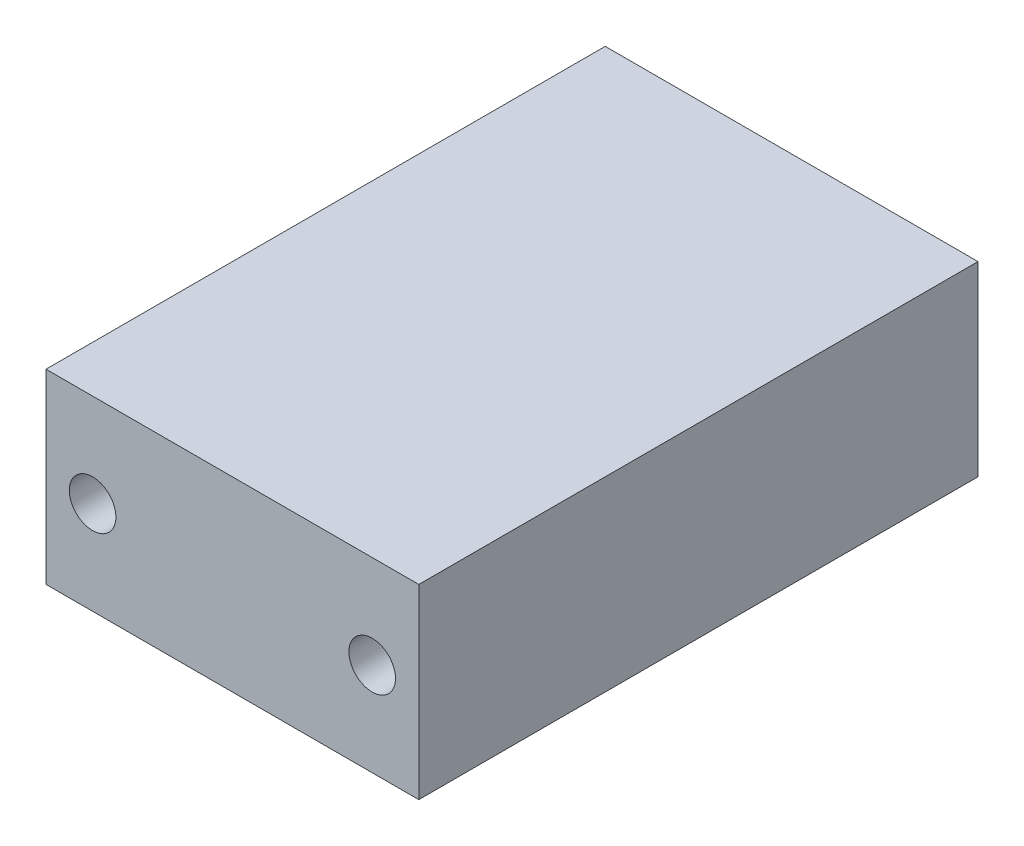
ISO-10303-21;
HEADER;
FILE_DESCRIPTION(('STEP AP214'),'2;1');
FILE_NAME('part.step','',(''),(''),'','','');
FILE_SCHEMA(('AUTOMOTIVE_DESIGN { 1 0 10303 214 1 1 1 1 }'));
ENDSEC;
DATA;
#1=APPLICATION_CONTEXT('core data for automotive mechanical design processes');
#2=APPLICATION_PROTOCOL_DEFINITION('international standard','automotive_design',2000,#1);
#3=PRODUCT_CONTEXT('',#1,'mechanical');
#4=PRODUCT('Part','Part','',(#3));
#5=PRODUCT_RELATED_PRODUCT_CATEGORY('part','',(#4));
#6=PRODUCT_DEFINITION_FORMATION('','',#4);
#7=PRODUCT_DEFINITION_CONTEXT('part definition',#1,'design');
#8=PRODUCT_DEFINITION('design','',#6,#7);
#9=PRODUCT_DEFINITION_SHAPE('','',#8);
#10=(LENGTH_UNIT() NAMED_UNIT(*) SI_UNIT(.MILLI.,.METRE.));
#11=(NAMED_UNIT(*) PLANE_ANGLE_UNIT() SI_UNIT($,.RADIAN.));
#12=(NAMED_UNIT(*) SI_UNIT($,.STERADIAN.) SOLID_ANGLE_UNIT());
#13=UNCERTAINTY_MEASURE_WITH_UNIT(LENGTH_MEASURE(1.E-05),#10,'distance_accuracy_value','');
#14=(GEOMETRIC_REPRESENTATION_CONTEXT(3) GLOBAL_UNCERTAINTY_ASSIGNED_CONTEXT((#13)) GLOBAL_UNIT_ASSIGNED_CONTEXT((#10,
#11,#12)) REPRESENTATION_CONTEXT('',''));
#15=CARTESIAN_POINT('',(0.,0.,0.));
#16=DIRECTION('',(0.,0.,1.));
#17=DIRECTION('',(1.,0.,0.));
#18=AXIS2_PLACEMENT_3D('',#15,#16,#17);
#19=CARTESIAN_POINT('',(40.,20.,120.));
#20=DIRECTION('',(-1.,0.,0.));
#21=DIRECTION('',(0.,0.,1.));
#22=AXIS2_PLACEMENT_3D('',#19,#20,#21);
#23=PLANE('',#22);
#24=DIRECTION('',(0.,1.,0.));
#25=VECTOR('',#24,1.);
#26=CARTESIAN_POINT('',(40.,20.,0.));
#27=LINE('',#26,#25);
#28=CARTESIAN_POINT('',(40.,-20.,0.));
#29=VERTEX_POINT('',#28);
#30=CARTESIAN_POINT('',(40.,20.,0.));
#31=VERTEX_POINT('',#30);
#32=EDGE_CURVE('E100',#29,#31,#27,.T.);
#33=ORIENTED_EDGE('',*,*,#32,.T.);
#34=DIRECTION('',(0.,0.,-1.));
#35=VECTOR('',#34,1.);
#36=CARTESIAN_POINT('',(40.,20.,120.));
#37=LINE('',#36,#35);
#38=CARTESIAN_POINT('',(40.,20.,120.));
#39=VERTEX_POINT('',#38);
#40=EDGE_CURVE('E11',#39,#31,#37,.T.);
#41=ORIENTED_EDGE('',*,*,#40,.F.);
#42=DIRECTION('',(0.,1.,0.));
#43=VECTOR('',#42,1.);
#44=CARTESIAN_POINT('',(40.,20.,120.));
#45=LINE('',#44,#43);
#46=CARTESIAN_POINT('',(40.,-20.,120.));
#47=VERTEX_POINT('',#46);
#48=EDGE_CURVE('E88',#47,#39,#45,.T.);
#49=ORIENTED_EDGE('',*,*,#48,.F.);
#50=DIRECTION('',(0.,0.,-1.));
#51=VECTOR('',#50,1.);
#52=CARTESIAN_POINT('',(40.,-20.,120.));
#53=LINE('',#52,#51);
#54=EDGE_CURVE('E96',#47,#29,#53,.T.);
#55=ORIENTED_EDGE('',*,*,#54,.T.);
#56=EDGE_LOOP('',(#33,#41,#49,#55));
#57=FACE_BOUND('',#56,.T.);
#58=ADVANCED_FACE('F37',(#57),#23,.F.);
#59=CARTESIAN_POINT('',(-40.,20.,120.));
#60=DIRECTION('',(0.,-1.,0.));
#61=DIRECTION('',(0.,0.,-1.));
#62=AXIS2_PLACEMENT_3D('',#59,#60,#61);
#63=PLANE('',#62);
#64=DIRECTION('',(-1.,0.,0.));
#65=VECTOR('',#64,1.);
#66=CARTESIAN_POINT('',(-40.,20.,0.));
#67=LINE('',#66,#65);
#68=CARTESIAN_POINT('',(-40.,20.,0.));
#69=VERTEX_POINT('',#68);
#70=EDGE_CURVE('E92',#31,#69,#67,.T.);
#71=ORIENTED_EDGE('',*,*,#70,.T.);
#72=DIRECTION('',(0.,0.,-1.));
#73=VECTOR('',#72,1.);
#74=CARTESIAN_POINT('',(-40.,20.,120.));
#75=LINE('',#74,#73);
#76=CARTESIAN_POINT('',(-40.,20.,120.));
#77=VERTEX_POINT('',#76);
#78=EDGE_CURVE('E45',#77,#69,#75,.T.);
#79=ORIENTED_EDGE('',*,*,#78,.F.);
#80=DIRECTION('',(-1.,0.,0.));
#81=VECTOR('',#80,1.);
#82=CARTESIAN_POINT('',(-40.,20.,120.));
#83=LINE('',#82,#81);
#84=EDGE_CURVE('E83',#39,#77,#83,.T.);
#85=ORIENTED_EDGE('',*,*,#84,.F.);
#86=ORIENTED_EDGE('',*,*,#40,.T.);
#87=EDGE_LOOP('',(#71,#79,#85,#86));
#88=FACE_BOUND('',#87,.T.);
#89=ADVANCED_FACE('F91',(#88),#63,.F.);
#90=CARTESIAN_POINT('',(-40.,20.,120.));
#91=DIRECTION('',(1.,0.,0.));
#92=DIRECTION('',(0.,0.,-1.));
#93=AXIS2_PLACEMENT_3D('',#90,#91,#92);
#94=PLANE('',#93);
#95=DIRECTION('',(0.,-1.,0.));
#96=VECTOR('',#95,1.);
#97=CARTESIAN_POINT('',(-40.,20.,0.));
#98=LINE('',#97,#96);
#99=CARTESIAN_POINT('',(-40.,-20.,0.));
#100=VERTEX_POINT('',#99);
#101=EDGE_CURVE('E70',#69,#100,#98,.T.);
#102=ORIENTED_EDGE('',*,*,#101,.T.);
#103=DIRECTION('',(0.,0.,-1.));
#104=VECTOR('',#103,1.);
#105=CARTESIAN_POINT('',(-40.,-20.,120.));
#106=LINE('',#105,#104);
#107=CARTESIAN_POINT('',(-40.,-20.,120.));
#108=VERTEX_POINT('',#107);
#109=EDGE_CURVE('E93',#108,#100,#106,.T.);
#110=ORIENTED_EDGE('',*,*,#109,.F.);
#111=DIRECTION('',(0.,-1.,0.));
#112=VECTOR('',#111,1.);
#113=CARTESIAN_POINT('',(-40.,20.,120.));
#114=LINE('',#113,#112);
#115=EDGE_CURVE('E86',#77,#108,#114,.T.);
#116=ORIENTED_EDGE('',*,*,#115,.F.);
#117=ORIENTED_EDGE('',*,*,#78,.T.);
#118=EDGE_LOOP('',(#102,#110,#116,#117));
#119=FACE_BOUND('',#118,.T.);
#120=ADVANCED_FACE('F94',(#119),#94,.F.);
#121=CARTESIAN_POINT('',(-40.,-20.,120.));
#122=DIRECTION('',(0.,1.,0.));
#123=DIRECTION('',(0.,0.,1.));
#124=AXIS2_PLACEMENT_3D('',#121,#122,#123);
#125=PLANE('',#124);
#126=DIRECTION('',(1.,0.,0.));
#127=VECTOR('',#126,1.);
#128=CARTESIAN_POINT('',(-40.,-20.,0.));
#129=LINE('',#128,#127);
#130=EDGE_CURVE('E76',#100,#29,#129,.T.);
#131=ORIENTED_EDGE('',*,*,#130,.T.);
#132=ORIENTED_EDGE('',*,*,#54,.F.);
#133=DIRECTION('',(1.,0.,0.));
#134=VECTOR('',#133,1.);
#135=CARTESIAN_POINT('',(-40.,-20.,120.));
#136=LINE('',#135,#134);
#137=EDGE_CURVE('E53',#108,#47,#136,.T.);
#138=ORIENTED_EDGE('',*,*,#137,.F.);
#139=ORIENTED_EDGE('',*,*,#109,.T.);
#140=EDGE_LOOP('',(#131,#132,#138,#139));
#141=FACE_BOUND('',#140,.T.);
#142=ADVANCED_FACE('F108',(#141),#125,.F.);
#143=CARTESIAN_POINT('',(0.,0.,120.));
#144=DIRECTION('',(0.,0.,1.));
#145=DIRECTION('',(1.,0.,0.));
#146=AXIS2_PLACEMENT_3D('',#143,#144,#145);
#147=PLANE('',#146);
#148=CARTESIAN_POINT('',(-30.,0.,120.));
#149=DIRECTION('',(0.,0.,1.));
#150=DIRECTION('',(1.,0.,0.));
#151=AXIS2_PLACEMENT_3D('',#148,#149,#150);
#152=CIRCLE('',#151,5.);
#153=CARTESIAN_POINT('',(-25.,0.,120.));
#154=VERTEX_POINT('',#153);
#155=EDGE_CURVE('E120',#154,#154,#152,.T.);
#156=ORIENTED_EDGE('',*,*,#155,.F.);
#157=EDGE_LOOP('',(#156));
#158=FACE_BOUND('',#157,.T.);
#159=CARTESIAN_POINT('',(30.,0.,120.));
#160=DIRECTION('',(0.,0.,1.));
#161=DIRECTION('',(1.,0.,0.));
#162=AXIS2_PLACEMENT_3D('',#159,#160,#161);
#163=CIRCLE('',#162,5.);
#164=CARTESIAN_POINT('',(35.,0.,120.));
#165=VERTEX_POINT('',#164);
#166=EDGE_CURVE('E114',#165,#165,#163,.T.);
#167=ORIENTED_EDGE('',*,*,#166,.F.);
#168=EDGE_LOOP('',(#167));
#169=FACE_BOUND('',#168,.T.);
#170=ORIENTED_EDGE('',*,*,#48,.T.);
#171=ORIENTED_EDGE('',*,*,#84,.T.);
#172=ORIENTED_EDGE('',*,*,#115,.T.);
#173=ORIENTED_EDGE('',*,*,#137,.T.);
#174=EDGE_LOOP('',(#170,#171,#172,#173));
#175=FACE_BOUND('',#174,.T.);
#176=ADVANCED_FACE('F84',(#158,#169,#175),#147,.T.);
#177=CARTESIAN_POINT('',(0.,0.,0.));
#178=DIRECTION('',(0.,0.,1.));
#179=DIRECTION('',(1.,0.,0.));
#180=AXIS2_PLACEMENT_3D('',#177,#178,#179);
#181=PLANE('',#180);
#182=CARTESIAN_POINT('',(-30.,0.,0.));
#183=DIRECTION('',(0.,0.,1.));
#184=DIRECTION('',(1.,0.,0.));
#185=AXIS2_PLACEMENT_3D('',#182,#183,#184);
#186=CIRCLE('',#185,5.);
#187=CARTESIAN_POINT('',(-25.,0.,0.));
#188=VERTEX_POINT('',#187);
#189=EDGE_CURVE('E103',#188,#188,#186,.T.);
#190=ORIENTED_EDGE('',*,*,#189,.T.);
#191=EDGE_LOOP('',(#190));
#192=FACE_BOUND('',#191,.T.);
#193=CARTESIAN_POINT('',(30.,0.,0.));
#194=DIRECTION('',(0.,0.,1.));
#195=DIRECTION('',(1.,0.,0.));
#196=AXIS2_PLACEMENT_3D('',#193,#194,#195);
#197=CIRCLE('',#196,5.);
#198=CARTESIAN_POINT('',(35.,0.,0.));
#199=VERTEX_POINT('',#198);
#200=EDGE_CURVE('E117',#199,#199,#197,.T.);
#201=ORIENTED_EDGE('',*,*,#200,.T.);
#202=EDGE_LOOP('',(#201));
#203=FACE_BOUND('',#202,.T.);
#204=ORIENTED_EDGE('',*,*,#32,.F.);
#205=ORIENTED_EDGE('',*,*,#130,.F.);
#206=ORIENTED_EDGE('',*,*,#101,.F.);
#207=ORIENTED_EDGE('',*,*,#70,.F.);
#208=EDGE_LOOP('',(#204,#205,#206,#207));
#209=FACE_BOUND('',#208,.T.);
#210=ADVANCED_FACE('F111',(#192,#203,#209),#181,.F.);
#211=CARTESIAN_POINT('',(30.,0.,0.));
#212=DIRECTION('',(0.,0.,1.));
#213=DIRECTION('',(1.,0.,0.));
#214=AXIS2_PLACEMENT_3D('',#211,#212,#213);
#215=CYLINDRICAL_SURFACE('',#214,5.);
#216=ORIENTED_EDGE('',*,*,#200,.F.);
#217=EDGE_LOOP('',(#216));
#218=FACE_BOUND('',#217,.T.);
#219=ORIENTED_EDGE('',*,*,#166,.T.);
#220=EDGE_LOOP('',(#219));
#221=FACE_BOUND('',#220,.T.);
#222=ADVANCED_FACE('F131',(#218,#221),#215,.F.);
#223=CARTESIAN_POINT('',(-30.,0.,0.));
#224=DIRECTION('',(0.,0.,1.));
#225=DIRECTION('',(1.,0.,0.));
#226=AXIS2_PLACEMENT_3D('',#223,#224,#225);
#227=CYLINDRICAL_SURFACE('',#226,5.);
#228=ORIENTED_EDGE('',*,*,#189,.F.);
#229=EDGE_LOOP('',(#228));
#230=FACE_BOUND('',#229,.T.);
#231=ORIENTED_EDGE('',*,*,#155,.T.);
#232=EDGE_LOOP('',(#231));
#233=FACE_BOUND('',#232,.T.);
#234=ADVANCED_FACE('F128',(#230,#233),#227,.F.);
#235=CLOSED_SHELL('',(#58,#89,#120,#142,#176,#210,#222,#234));
#236=MANIFOLD_SOLID_BREP('B2',#235);
#237=ADVANCED_BREP_SHAPE_REPRESENTATION('',(#18,#236),#14);
#238=SHAPE_DEFINITION_REPRESENTATION(#9,#237);
ENDSEC;
END-ISO-10303-21;
